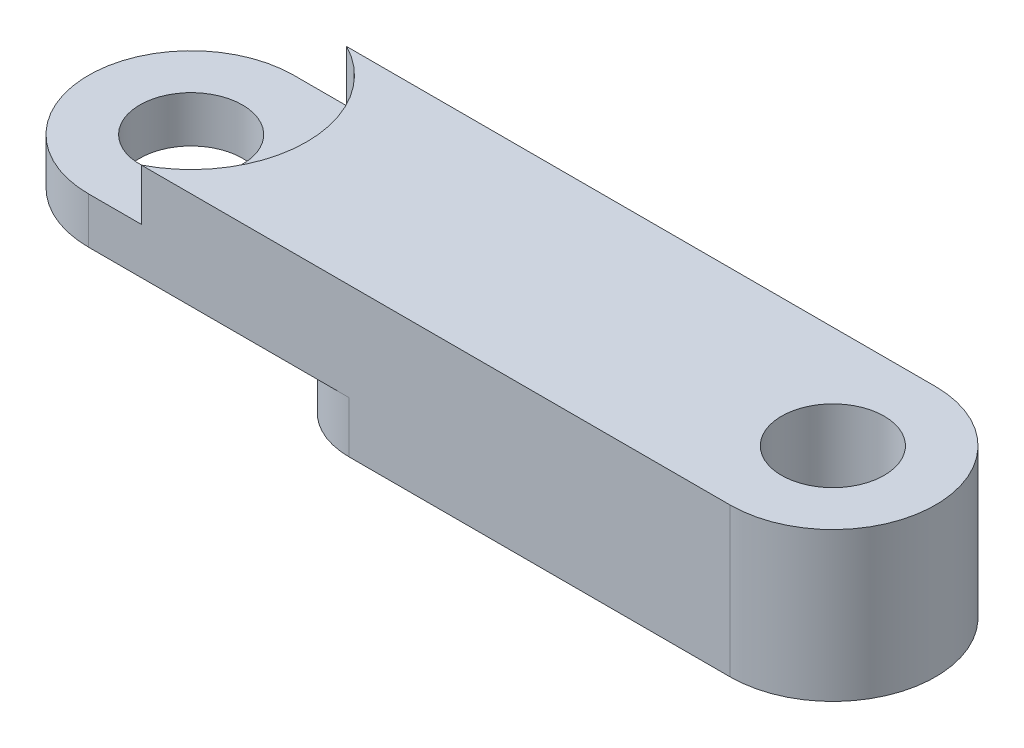
ISO-10303-21;
HEADER;
FILE_DESCRIPTION(('STEP AP214'),'2;1');
FILE_NAME('part.step','',(''),(''),'','','');
FILE_SCHEMA(('AUTOMOTIVE_DESIGN { 1 0 10303 214 1 1 1 1 }'));
ENDSEC;
DATA;
#1=APPLICATION_CONTEXT('core data for automotive mechanical design processes');
#2=APPLICATION_PROTOCOL_DEFINITION('international standard','automotive_design',2000,#1);
#3=PRODUCT_CONTEXT('',#1,'mechanical');
#4=PRODUCT('Part','Part','',(#3));
#5=PRODUCT_RELATED_PRODUCT_CATEGORY('part','',(#4));
#6=PRODUCT_DEFINITION_FORMATION('','',#4);
#7=PRODUCT_DEFINITION_CONTEXT('part definition',#1,'design');
#8=PRODUCT_DEFINITION('design','',#6,#7);
#9=PRODUCT_DEFINITION_SHAPE('','',#8);
#10=(LENGTH_UNIT() NAMED_UNIT(*) SI_UNIT(.MILLI.,.METRE.));
#11=(NAMED_UNIT(*) PLANE_ANGLE_UNIT() SI_UNIT($,.RADIAN.));
#12=(NAMED_UNIT(*) SI_UNIT($,.STERADIAN.) SOLID_ANGLE_UNIT());
#13=UNCERTAINTY_MEASURE_WITH_UNIT(LENGTH_MEASURE(1.E-05),#10,'distance_accuracy_value','');
#14=(GEOMETRIC_REPRESENTATION_CONTEXT(3) GLOBAL_UNCERTAINTY_ASSIGNED_CONTEXT((#13)) GLOBAL_UNIT_ASSIGNED_CONTEXT((#10,
#11,#12)) REPRESENTATION_CONTEXT('',''));
#15=CARTESIAN_POINT('',(0.,0.,0.));
#16=DIRECTION('',(0.,0.,1.));
#17=DIRECTION('',(1.,0.,0.));
#18=AXIS2_PLACEMENT_3D('',#15,#16,#17);
#19=CARTESIAN_POINT('',(-125.,58.,0.));
#20=DIRECTION('',(0.,-1.,0.));
#21=DIRECTION('',(0.,0.,-1.));
#22=AXIS2_PLACEMENT_3D('',#19,#20,#21);
#23=CYLINDRICAL_SURFACE('',#22,40.);
#24=CARTESIAN_POINT('',(-125.,20.,0.));
#25=DIRECTION('',(0.,-1.,0.));
#26=DIRECTION('',(0.,0.,-1.));
#27=AXIS2_PLACEMENT_3D('',#24,#25,#26);
#28=CIRCLE('',#27,40.);
#29=CARTESIAN_POINT('',(-125.,20.,40.));
#30=VERTEX_POINT('',#29);
#31=CARTESIAN_POINT('',(-125.,20.,-40.));
#32=VERTEX_POINT('',#31);
#33=EDGE_CURVE('E117',#30,#32,#28,.T.);
#34=ORIENTED_EDGE('',*,*,#33,.F.);
#35=DIRECTION('',(0.,-1.,0.));
#36=VECTOR('',#35,1.);
#37=CARTESIAN_POINT('',(-125.,58.,40.));
#38=LINE('',#37,#36);
#39=CARTESIAN_POINT('',(-125.,38.,40.));
#40=VERTEX_POINT('',#39);
#41=EDGE_CURVE('E129',#40,#30,#38,.T.);
#42=ORIENTED_EDGE('',*,*,#41,.F.);
#43=CARTESIAN_POINT('',(-125.,38.,0.));
#44=DIRECTION('',(0.,1.,0.));
#45=DIRECTION('',(0.,0.,1.));
#46=AXIS2_PLACEMENT_3D('',#43,#44,#45);
#47=CIRCLE('',#46,40.);
#48=CARTESIAN_POINT('',(-125.,38.,-40.));
#49=VERTEX_POINT('',#48);
#50=EDGE_CURVE('E191',#49,#40,#47,.T.);
#51=ORIENTED_EDGE('',*,*,#50,.F.);
#52=DIRECTION('',(0.,-1.,0.));
#53=VECTOR('',#52,1.);
#54=CARTESIAN_POINT('',(-125.,58.,-40.));
#55=LINE('',#54,#53);
#56=EDGE_CURVE('E131',#49,#32,#55,.T.);
#57=ORIENTED_EDGE('',*,*,#56,.T.);
#58=EDGE_LOOP('',(#34,#42,#51,#57));
#59=FACE_BOUND('',#58,.T.);
#60=ADVANCED_FACE('F41',(#59),#23,.T.);
#61=CARTESIAN_POINT('',(-125.,58.,0.));
#62=DIRECTION('',(0.,-1.,0.));
#63=DIRECTION('',(0.,0.,-1.));
#64=AXIS2_PLACEMENT_3D('',#61,#62,#63);
#65=CYLINDRICAL_SURFACE('',#64,20.);
#66=CARTESIAN_POINT('',(-125.,38.,0.));
#67=DIRECTION('',(0.,1.,0.));
#68=DIRECTION('',(0.,0.,1.));
#69=AXIS2_PLACEMENT_3D('',#66,#67,#68);
#70=CIRCLE('',#69,20.);
#71=CARTESIAN_POINT('',(-125.,38.,-20.));
#72=VERTEX_POINT('',#71);
#73=EDGE_CURVE('E146',#72,#72,#70,.T.);
#74=CARTESIAN_POINT('',(-125.,20.,0.));
#75=DIRECTION('',(0.,-1.,0.));
#76=DIRECTION('',(0.,0.,-1.));
#77=AXIS2_PLACEMENT_3D('',#74,#75,#76);
#78=CIRCLE('',#77,20.);
#79=CARTESIAN_POINT('',(-125.,20.,-20.));
#80=VERTEX_POINT('',#79);
#81=EDGE_CURVE('E124',#80,#80,#78,.T.);
#82=CARTESIAN_POINT('',(-125.,38.,-20.));
#83=CARTESIAN_POINT('',(-125.,37.8125,-20.));
#84=CARTESIAN_POINT('',(-125.,37.625,-20.));
#85=CARTESIAN_POINT('',(-125.,37.25,-20.));
#86=CARTESIAN_POINT('',(-125.,37.0625,-20.));
#87=CARTESIAN_POINT('',(-125.,36.6875,-20.));
#88=CARTESIAN_POINT('',(-125.,36.5,-20.));
#89=CARTESIAN_POINT('',(-125.,36.125,-20.));
#90=CARTESIAN_POINT('',(-125.,35.9375,-20.));
#91=CARTESIAN_POINT('',(-125.,35.5625,-20.));
#92=CARTESIAN_POINT('',(-125.,35.375,-20.));
#93=CARTESIAN_POINT('',(-125.,35.,-20.));
#94=CARTESIAN_POINT('',(-125.,34.8125,-20.));
#95=CARTESIAN_POINT('',(-125.,34.4375,-20.));
#96=CARTESIAN_POINT('',(-125.,34.25,-20.));
#97=CARTESIAN_POINT('',(-125.,33.875,-20.));
#98=CARTESIAN_POINT('',(-125.,33.6875,-20.));
#99=CARTESIAN_POINT('',(-125.,33.3125,-20.));
#100=CARTESIAN_POINT('',(-125.,33.125,-20.));
#101=CARTESIAN_POINT('',(-125.,32.75,-20.));
#102=CARTESIAN_POINT('',(-125.,32.5625,-20.));
#103=CARTESIAN_POINT('',(-125.,32.1875,-20.));
#104=CARTESIAN_POINT('',(-125.,32.,-20.));
#105=CARTESIAN_POINT('',(-125.,31.625,-20.));
#106=CARTESIAN_POINT('',(-125.,31.4375,-20.));
#107=CARTESIAN_POINT('',(-125.,31.0625,-20.));
#108=CARTESIAN_POINT('',(-125.,30.875,-20.));
#109=CARTESIAN_POINT('',(-125.,30.5,-20.));
#110=CARTESIAN_POINT('',(-125.,30.3125,-20.));
#111=CARTESIAN_POINT('',(-125.,29.9375,-20.));
#112=CARTESIAN_POINT('',(-125.,29.75,-20.));
#113=CARTESIAN_POINT('',(-125.,29.375,-20.));
#114=CARTESIAN_POINT('',(-125.,29.1875,-20.));
#115=CARTESIAN_POINT('',(-125.,28.8125,-20.));
#116=CARTESIAN_POINT('',(-125.,28.625,-20.));
#117=CARTESIAN_POINT('',(-125.,28.25,-20.));
#118=CARTESIAN_POINT('',(-125.,28.0625,-20.));
#119=CARTESIAN_POINT('',(-125.,27.6875,-20.));
#120=CARTESIAN_POINT('',(-125.,27.5,-20.));
#121=CARTESIAN_POINT('',(-125.,27.125,-20.));
#122=CARTESIAN_POINT('',(-125.,26.9375,-20.));
#123=CARTESIAN_POINT('',(-125.,26.5625,-20.));
#124=CARTESIAN_POINT('',(-125.,26.375,-20.));
#125=CARTESIAN_POINT('',(-125.,26.,-20.));
#126=CARTESIAN_POINT('',(-125.,25.8125,-20.));
#127=CARTESIAN_POINT('',(-125.,25.4375,-20.));
#128=CARTESIAN_POINT('',(-125.,25.25,-20.));
#129=CARTESIAN_POINT('',(-125.,24.875,-20.));
#130=CARTESIAN_POINT('',(-125.,24.6875,-20.));
#131=CARTESIAN_POINT('',(-125.,24.3125,-20.));
#132=CARTESIAN_POINT('',(-125.,24.125,-20.));
#133=CARTESIAN_POINT('',(-125.,23.75,-20.));
#134=CARTESIAN_POINT('',(-125.,23.5625,-20.));
#135=CARTESIAN_POINT('',(-125.,23.1875,-20.));
#136=CARTESIAN_POINT('',(-125.,23.,-20.));
#137=CARTESIAN_POINT('',(-125.,22.625,-20.));
#138=CARTESIAN_POINT('',(-125.,22.4375,-20.));
#139=CARTESIAN_POINT('',(-125.,22.0625,-20.));
#140=CARTESIAN_POINT('',(-125.,21.875,-20.));
#141=CARTESIAN_POINT('',(-125.,21.5,-20.));
#142=CARTESIAN_POINT('',(-125.,21.3125,-20.));
#143=CARTESIAN_POINT('',(-125.,20.9375,-20.));
#144=CARTESIAN_POINT('',(-125.,20.75,-20.));
#145=CARTESIAN_POINT('',(-125.,20.375,-20.));
#146=CARTESIAN_POINT('',(-125.,20.1875,-20.));
#147=CARTESIAN_POINT('',(-125.,20.,-20.));
#148=B_SPLINE_CURVE_WITH_KNOTS('',3,(#82,#83,#84,#85,#86,#87,#88,#89,#90,#91,#92,#93,#94,#95,
#96,#97,#98,#99,#100,#101,#102,#103,#104,#105,#106,#107,#108,#109,#110,#111,#112,#113,#114,#115,
#116,#117,#118,#119,#120,#121,#122,#123,#124,#125,#126,#127,#128,#129,#130,#131,#132,#133,#134,
#135,#136,#137,#138,#139,#140,#141,#142,#143,#144,#145,#146,#147),.UNSPECIFIED.,.F.,.F.,(4,2,2,
2,2,2,2,2,2,2,2,2,2,2,2,2,2,2,2,2,2,2,2,2,2,2,2,2,2,2,2,2,4),(0.,0.562500000000007,1.125,
1.68750000000001,2.25,2.8125,3.375,3.9375,4.5,5.0625,5.62500000000001,6.1875,6.75000000000001,
7.3125,7.875,8.4375,9.00000000000001,9.56250000000001,10.125,10.6875,11.25,11.8125,12.375,
12.9375,13.5,14.0625,14.625,15.1875,15.75,16.3125,16.875,17.4375,18.),.UNSPECIFIED.);
#149=EDGE_CURVE('BSEAM233',#72,#80,#148,.T.);
#150=ORIENTED_EDGE('',*,*,#73,.T.);
#151=ORIENTED_EDGE('',*,*,#81,.T.);
#152=ORIENTED_EDGE('',*,*,#149,.T.);
#153=ORIENTED_EDGE('',*,*,#149,.F.);
#154=EDGE_LOOP('',(#150,#152,#151,#153));
#155=FACE_BOUND('',#154,.T.);
#156=ADVANCED_FACE('F233',(#155),#65,.F.);
#157=CARTESIAN_POINT('',(-125.,58.,0.));
#158=DIRECTION('',(0.,1.,0.));
#159=DIRECTION('',(0.,0.,1.));
#160=AXIS2_PLACEMENT_3D('',#157,#158,#159);
#161=PLANE('',#160);
#162=CARTESIAN_POINT('',(-125.,58.,0.));
#163=DIRECTION('',(0.,1.,0.));
#164=DIRECTION('',(0.,0.,1.));
#165=AXIS2_PLACEMENT_3D('',#162,#163,#164);
#166=CIRCLE('',#165,45.);
#167=CARTESIAN_POINT('',(-104.384471871912,58.,40.));
#168=VERTEX_POINT('',#167);
#169=CARTESIAN_POINT('',(-104.384471871912,58.,-40.));
#170=VERTEX_POINT('',#169);
#171=EDGE_CURVE('E190',#168,#170,#166,.T.);
#172=ORIENTED_EDGE('',*,*,#171,.F.);
#173=DIRECTION('',(1.,0.,0.));
#174=VECTOR('',#173,1.);
#175=CARTESIAN_POINT('',(-125.,58.,40.));
#176=LINE('',#175,#174);
#177=CARTESIAN_POINT('',(125.,58.,40.));
#178=VERTEX_POINT('',#177);
#179=EDGE_CURVE('E206',#168,#178,#176,.T.);
#180=ORIENTED_EDGE('',*,*,#179,.T.);
#181=CARTESIAN_POINT('',(125.,58.,0.));
#182=DIRECTION('',(0.,1.,0.));
#183=DIRECTION('',(0.,0.,1.));
#184=AXIS2_PLACEMENT_3D('',#181,#182,#183);
#185=CIRCLE('',#184,40.);
#186=CARTESIAN_POINT('',(125.000000012017,58.,-40.));
#187=VERTEX_POINT('',#186);
#188=EDGE_CURVE('E208',#178,#187,#185,.T.);
#189=ORIENTED_EDGE('',*,*,#188,.T.);
#190=DIRECTION('',(-1.,0.,0.));
#191=VECTOR('',#190,1.);
#192=CARTESIAN_POINT('',(-125.,58.,-40.));
#193=LINE('',#192,#191);
#194=EDGE_CURVE('E209',#187,#170,#193,.T.);
#195=ORIENTED_EDGE('',*,*,#194,.T.);
#196=EDGE_LOOP('',(#172,#180,#189,#195));
#197=FACE_BOUND('',#196,.T.);
#198=CARTESIAN_POINT('',(125.,58.,0.));
#199=DIRECTION('',(0.,1.,0.));
#200=DIRECTION('',(0.,0.,1.));
#201=AXIS2_PLACEMENT_3D('',#198,#199,#200);
#202=CIRCLE('',#201,20.);
#203=CARTESIAN_POINT('',(125.,58.,-20.));
#204=VERTEX_POINT('',#203);
#205=EDGE_CURVE('E199',#204,#204,#202,.T.);
#206=ORIENTED_EDGE('',*,*,#205,.F.);
#207=EDGE_LOOP('',(#206));
#208=FACE_BOUND('',#207,.T.);
#209=ADVANCED_FACE('F238',(#197,#208),#161,.T.);
#210=CARTESIAN_POINT('',(-125.,0.,0.));
#211=DIRECTION('',(0.,1.,0.));
#212=DIRECTION('',(0.,0.,1.));
#213=AXIS2_PLACEMENT_3D('',#210,#211,#212);
#214=PLANE('',#213);
#215=DIRECTION('',(1.,0.,0.));
#216=VECTOR('',#215,1.);
#217=CARTESIAN_POINT('',(-125.,0.,40.));
#218=LINE('',#217,#216);
#219=CARTESIAN_POINT('',(-23.501817709407,0.,40.));
#220=VERTEX_POINT('',#219);
#221=CARTESIAN_POINT('',(125.,0.,40.));
#222=VERTEX_POINT('',#221);
#223=EDGE_CURVE('E201',#220,#222,#218,.T.);
#224=ORIENTED_EDGE('',*,*,#223,.F.);
#225=CARTESIAN_POINT('',(-23.501817709407,0.,10.));
#226=DIRECTION('',(0.,1.,0.));
#227=DIRECTION('',(0.,0.,1.));
#228=AXIS2_PLACEMENT_3D('',#225,#226,#227);
#229=CIRCLE('',#228,30.);
#230=CARTESIAN_POINT('',(-53.501817709407,0.,10.));
#231=VERTEX_POINT('',#230);
#232=EDGE_CURVE('E158',#220,#231,#229,.F.);
#233=ORIENTED_EDGE('',*,*,#232,.T.);
#234=DIRECTION('',(0.,0.,1.));
#235=VECTOR('',#234,1.);
#236=CARTESIAN_POINT('',(-53.501817709407,0.,-40.));
#237=LINE('',#236,#235);
#238=CARTESIAN_POINT('',(-53.501817709407,0.,-10.));
#239=VERTEX_POINT('',#238);
#240=EDGE_CURVE('E176',#239,#231,#237,.T.);
#241=ORIENTED_EDGE('',*,*,#240,.F.);
#242=CARTESIAN_POINT('',(-23.501817709407,0.,-10.));
#243=DIRECTION('',(0.,1.,0.));
#244=DIRECTION('',(0.,0.,1.));
#245=AXIS2_PLACEMENT_3D('',#242,#243,#244);
#246=CIRCLE('',#245,30.);
#247=CARTESIAN_POINT('',(-23.501817709407,0.,-40.));
#248=VERTEX_POINT('',#247);
#249=EDGE_CURVE('E156',#239,#248,#246,.F.);
#250=ORIENTED_EDGE('',*,*,#249,.T.);
#251=DIRECTION('',(-1.,0.,0.));
#252=VECTOR('',#251,1.);
#253=CARTESIAN_POINT('',(-125.,0.,-40.));
#254=LINE('',#253,#252);
#255=CARTESIAN_POINT('',(125.000000012017,0.,-40.));
#256=VERTEX_POINT('',#255);
#257=EDGE_CURVE('E172',#256,#248,#254,.T.);
#258=ORIENTED_EDGE('',*,*,#257,.F.);
#259=CARTESIAN_POINT('',(125.,0.,0.));
#260=DIRECTION('',(0.,1.,0.));
#261=DIRECTION('',(0.,0.,1.));
#262=AXIS2_PLACEMENT_3D('',#259,#260,#261);
#263=CIRCLE('',#262,40.);
#264=EDGE_CURVE('E212',#222,#256,#263,.T.);
#265=ORIENTED_EDGE('',*,*,#264,.F.);
#266=EDGE_LOOP('',(#224,#233,#241,#250,#258,#265));
#267=FACE_BOUND('',#266,.T.);
#268=CARTESIAN_POINT('',(125.,0.,0.));
#269=DIRECTION('',(0.,1.,0.));
#270=DIRECTION('',(0.,0.,1.));
#271=AXIS2_PLACEMENT_3D('',#268,#269,#270);
#272=CIRCLE('',#271,20.);
#273=CARTESIAN_POINT('',(125.,0.,-20.));
#274=VERTEX_POINT('',#273);
#275=EDGE_CURVE('E200',#274,#274,#272,.T.);
#276=ORIENTED_EDGE('',*,*,#275,.T.);
#277=EDGE_LOOP('',(#276));
#278=FACE_BOUND('',#277,.T.);
#279=ADVANCED_FACE('F181',(#267,#278),#214,.F.);
#280=CARTESIAN_POINT('',(-125.,58.,40.));
#281=DIRECTION('',(0.,0.,-1.));
#282=DIRECTION('',(-1.,0.,0.));
#283=AXIS2_PLACEMENT_3D('',#280,#281,#282);
#284=PLANE('',#283);
#285=DIRECTION('',(-1.,0.,0.));
#286=VECTOR('',#285,1.);
#287=CARTESIAN_POINT('',(-125.,20.,40.));
#288=LINE('',#287,#286);
#289=CARTESIAN_POINT('',(-23.501817709407,20.,40.));
#290=VERTEX_POINT('',#289);
#291=EDGE_CURVE('E111',#290,#30,#288,.T.);
#292=ORIENTED_EDGE('',*,*,#291,.F.);
#293=DIRECTION('',(0.,-1.,0.));
#294=VECTOR('',#293,1.);
#295=CARTESIAN_POINT('',(-23.501817709407,58.,40.));
#296=LINE('',#295,#294);
#297=EDGE_CURVE('E152',#290,#220,#296,.T.);
#298=ORIENTED_EDGE('',*,*,#297,.T.);
#299=ORIENTED_EDGE('',*,*,#223,.T.);
#300=DIRECTION('',(0.,-1.,0.));
#301=VECTOR('',#300,1.);
#302=CARTESIAN_POINT('',(125.,58.,40.));
#303=LINE('',#302,#301);
#304=EDGE_CURVE('E136',#178,#222,#303,.T.);
#305=ORIENTED_EDGE('',*,*,#304,.F.);
#306=ORIENTED_EDGE('',*,*,#179,.F.);
#307=DIRECTION('',(0.,1.,0.));
#308=VECTOR('',#307,1.);
#309=CARTESIAN_POINT('',(-104.384471871912,38.,40.));
#310=LINE('',#309,#308);
#311=CARTESIAN_POINT('',(-104.384471871912,38.,40.));
#312=VERTEX_POINT('',#311);
#313=EDGE_CURVE('E197',#168,#312,#310,.F.);
#314=ORIENTED_EDGE('',*,*,#313,.T.);
#315=DIRECTION('',(1.,0.,0.));
#316=VECTOR('',#315,1.);
#317=CARTESIAN_POINT('',(-125.,38.,40.));
#318=LINE('',#317,#316);
#319=EDGE_CURVE('E140',#40,#312,#318,.T.);
#320=ORIENTED_EDGE('',*,*,#319,.F.);
#321=ORIENTED_EDGE('',*,*,#41,.T.);
#322=EDGE_LOOP('',(#292,#298,#299,#305,#306,#314,#320,#321));
#323=FACE_BOUND('',#322,.T.);
#324=ADVANCED_FACE('F135',(#323),#284,.F.);
#325=CARTESIAN_POINT('',(125.,58.,0.));
#326=DIRECTION('',(0.,-1.,0.));
#327=DIRECTION('',(0.,0.,-1.));
#328=AXIS2_PLACEMENT_3D('',#325,#326,#327);
#329=CYLINDRICAL_SURFACE('',#328,40.);
#330=ORIENTED_EDGE('',*,*,#264,.T.);
#331=DIRECTION('',(0.,-1.,0.));
#332=VECTOR('',#331,1.);
#333=CARTESIAN_POINT('',(125.000000012017,58.,-40.));
#334=LINE('',#333,#332);
#335=EDGE_CURVE('E145',#187,#256,#334,.T.);
#336=ORIENTED_EDGE('',*,*,#335,.F.);
#337=ORIENTED_EDGE('',*,*,#188,.F.);
#338=ORIENTED_EDGE('',*,*,#304,.T.);
#339=EDGE_LOOP('',(#330,#336,#337,#338));
#340=FACE_BOUND('',#339,.T.);
#341=ADVANCED_FACE('F225',(#340),#329,.T.);
#342=CARTESIAN_POINT('',(-125.,58.,-40.));
#343=DIRECTION('',(0.,0.,1.));
#344=DIRECTION('',(1.,0.,0.));
#345=AXIS2_PLACEMENT_3D('',#342,#343,#344);
#346=PLANE('',#345);
#347=ORIENTED_EDGE('',*,*,#257,.T.);
#348=DIRECTION('',(0.,-1.,0.));
#349=VECTOR('',#348,1.);
#350=CARTESIAN_POINT('',(-23.501817709407,58.,-40.));
#351=LINE('',#350,#349);
#352=CARTESIAN_POINT('',(-23.501817709407,20.,-40.));
#353=VERTEX_POINT('',#352);
#354=EDGE_CURVE('E164',#248,#353,#351,.F.);
#355=ORIENTED_EDGE('',*,*,#354,.T.);
#356=DIRECTION('',(1.,0.,0.));
#357=VECTOR('',#356,1.);
#358=CARTESIAN_POINT('',(-125.,20.,-40.));
#359=LINE('',#358,#357);
#360=EDGE_CURVE('E54',#32,#353,#359,.T.);
#361=ORIENTED_EDGE('',*,*,#360,.F.);
#362=ORIENTED_EDGE('',*,*,#56,.F.);
#363=DIRECTION('',(-1.,0.,0.));
#364=VECTOR('',#363,1.);
#365=CARTESIAN_POINT('',(-125.,38.,-40.));
#366=LINE('',#365,#364);
#367=CARTESIAN_POINT('',(-104.384471871912,38.,-40.));
#368=VERTEX_POINT('',#367);
#369=EDGE_CURVE('E147',#368,#49,#366,.T.);
#370=ORIENTED_EDGE('',*,*,#369,.F.);
#371=DIRECTION('',(0.,1.,0.));
#372=VECTOR('',#371,1.);
#373=CARTESIAN_POINT('',(-104.384471871912,38.,-40.));
#374=LINE('',#373,#372);
#375=EDGE_CURVE('E139',#368,#170,#374,.T.);
#376=ORIENTED_EDGE('',*,*,#375,.T.);
#377=ORIENTED_EDGE('',*,*,#194,.F.);
#378=ORIENTED_EDGE('',*,*,#335,.T.);
#379=EDGE_LOOP('',(#347,#355,#361,#362,#370,#376,#377,#378));
#380=FACE_BOUND('',#379,.T.);
#381=ADVANCED_FACE('F166',(#380),#346,.F.);
#382=CARTESIAN_POINT('',(125.,58.,0.));
#383=DIRECTION('',(0.,-1.,0.));
#384=DIRECTION('',(0.,0.,-1.));
#385=AXIS2_PLACEMENT_3D('',#382,#383,#384);
#386=CYLINDRICAL_SURFACE('',#385,20.);
#387=CARTESIAN_POINT('',(125.,58.,-20.));
#388=CARTESIAN_POINT('',(125.,57.3958333333333,-20.));
#389=CARTESIAN_POINT('',(125.,56.7916666666667,-20.));
#390=CARTESIAN_POINT('',(125.,55.5833333333333,-20.));
#391=CARTESIAN_POINT('',(125.,54.9791666666667,-20.));
#392=CARTESIAN_POINT('',(125.,53.7708333333333,-20.));
#393=CARTESIAN_POINT('',(125.,53.1666666666667,-20.));
#394=CARTESIAN_POINT('',(125.,51.9583333333333,-20.));
#395=CARTESIAN_POINT('',(125.,51.3541666666667,-20.));
#396=CARTESIAN_POINT('',(125.,50.1458333333333,-20.));
#397=CARTESIAN_POINT('',(125.,49.5416666666667,-20.));
#398=CARTESIAN_POINT('',(125.,48.3333333333333,-20.));
#399=CARTESIAN_POINT('',(125.,47.7291666666667,-20.));
#400=CARTESIAN_POINT('',(125.,46.5208333333333,-20.));
#401=CARTESIAN_POINT('',(125.,45.9166666666667,-20.));
#402=CARTESIAN_POINT('',(125.,44.7083333333333,-20.));
#403=CARTESIAN_POINT('',(125.,44.1041666666667,-20.));
#404=CARTESIAN_POINT('',(125.,42.8958333333333,-20.));
#405=CARTESIAN_POINT('',(125.,42.2916666666667,-20.));
#406=CARTESIAN_POINT('',(125.,41.0833333333333,-20.));
#407=CARTESIAN_POINT('',(125.,40.4791666666667,-20.));
#408=CARTESIAN_POINT('',(125.,39.2708333333333,-20.));
#409=CARTESIAN_POINT('',(125.,38.6666666666667,-20.));
#410=CARTESIAN_POINT('',(125.,37.4583333333333,-20.));
#411=CARTESIAN_POINT('',(125.,36.8541666666667,-20.));
#412=CARTESIAN_POINT('',(125.,35.6458333333333,-20.));
#413=CARTESIAN_POINT('',(125.,35.0416666666667,-20.));
#414=CARTESIAN_POINT('',(125.,33.8333333333333,-20.));
#415=CARTESIAN_POINT('',(125.,33.2291666666667,-20.));
#416=CARTESIAN_POINT('',(125.,32.0208333333333,-20.));
#417=CARTESIAN_POINT('',(125.,31.4166666666667,-20.));
#418=CARTESIAN_POINT('',(125.,30.2083333333333,-20.));
#419=CARTESIAN_POINT('',(125.,29.6041666666667,-20.));
#420=CARTESIAN_POINT('',(125.,28.3958333333333,-20.));
#421=CARTESIAN_POINT('',(125.,27.7916666666667,-20.));
#422=CARTESIAN_POINT('',(125.,26.5833333333333,-20.));
#423=CARTESIAN_POINT('',(125.,25.9791666666667,-20.));
#424=CARTESIAN_POINT('',(125.,24.7708333333333,-20.));
#425=CARTESIAN_POINT('',(125.,24.1666666666667,-20.));
#426=CARTESIAN_POINT('',(125.,22.9583333333333,-20.));
#427=CARTESIAN_POINT('',(125.,22.3541666666667,-20.));
#428=CARTESIAN_POINT('',(125.,21.1458333333333,-20.));
#429=CARTESIAN_POINT('',(125.,20.5416666666667,-20.));
#430=CARTESIAN_POINT('',(125.,19.3333333333333,-20.));
#431=CARTESIAN_POINT('',(125.,18.7291666666667,-20.));
#432=CARTESIAN_POINT('',(125.,17.5208333333333,-20.));
#433=CARTESIAN_POINT('',(125.,16.9166666666667,-20.));
#434=CARTESIAN_POINT('',(125.,15.7083333333333,-20.));
#435=CARTESIAN_POINT('',(125.,15.1041666666667,-20.));
#436=CARTESIAN_POINT('',(125.,13.8958333333333,-20.));
#437=CARTESIAN_POINT('',(125.,13.2916666666667,-20.));
#438=CARTESIAN_POINT('',(125.,12.0833333333333,-20.));
#439=CARTESIAN_POINT('',(125.,11.4791666666667,-20.));
#440=CARTESIAN_POINT('',(125.,10.2708333333333,-20.));
#441=CARTESIAN_POINT('',(125.,9.66666666666667,-20.));
#442=CARTESIAN_POINT('',(125.,8.45833333333333,-20.));
#443=CARTESIAN_POINT('',(125.,7.85416666666667,-20.));
#444=CARTESIAN_POINT('',(125.,6.64583333333333,-20.));
#445=CARTESIAN_POINT('',(125.,6.04166666666667,-20.));
#446=CARTESIAN_POINT('',(125.,4.83333333333333,-20.));
#447=CARTESIAN_POINT('',(125.,4.22916666666667,-20.));
#448=CARTESIAN_POINT('',(125.,3.02083333333334,-20.));
#449=CARTESIAN_POINT('',(125.,2.41666666666667,-20.));
#450=CARTESIAN_POINT('',(125.,1.20833333333333,-20.));
#451=CARTESIAN_POINT('',(125.,0.604166666666666,-20.));
#452=CARTESIAN_POINT('',(125.,0.,-20.));
#453=B_SPLINE_CURVE_WITH_KNOTS('',3,(#387,#388,#389,#390,#391,#392,#393,#394,#395,#396,#397,
#398,#399,#400,#401,#402,#403,#404,#405,#406,#407,#408,#409,#410,#411,#412,#413,#414,#415,#416,
#417,#418,#419,#420,#421,#422,#423,#424,#425,#426,#427,#428,#429,#430,#431,#432,#433,#434,#435,
#436,#437,#438,#439,#440,#441,#442,#443,#444,#445,#446,#447,#448,#449,#450,#451,#452),
.UNSPECIFIED.,.F.,.F.,(4,2,2,2,2,2,2,2,2,2,2,2,2,2,2,2,2,2,2,2,2,2,2,2,2,2,2,2,2,2,2,2,4),(0.,
1.8125,3.625,5.4375,7.25000000000001,9.0625,10.875,12.6875,14.5,16.3125,18.125,19.9375,21.75,
23.5625,25.375,27.1875,29.,30.8125,32.625,34.4375,36.25,38.0625,39.875,41.6875,43.5,45.3125,
47.125,48.9375,50.75,52.5625,54.375,56.1875,58.),.UNSPECIFIED.);
#454=EDGE_CURVE('BSEAM248',#204,#274,#453,.T.);
#455=ORIENTED_EDGE('',*,*,#205,.T.);
#456=ORIENTED_EDGE('',*,*,#275,.F.);
#457=ORIENTED_EDGE('',*,*,#454,.T.);
#458=ORIENTED_EDGE('',*,*,#454,.F.);
#459=EDGE_LOOP('',(#455,#457,#456,#458));
#460=FACE_BOUND('',#459,.T.);
#461=ADVANCED_FACE('F248',(#460),#386,.F.);
#462=CARTESIAN_POINT('',(-125.,38.,0.));
#463=DIRECTION('',(0.,1.,0.));
#464=DIRECTION('',(0.,0.,1.));
#465=AXIS2_PLACEMENT_3D('',#462,#463,#464);
#466=CYLINDRICAL_SURFACE('',#465,45.);
#467=ORIENTED_EDGE('',*,*,#171,.T.);
#468=ORIENTED_EDGE('',*,*,#375,.F.);
#469=CARTESIAN_POINT('',(-125.,38.,0.));
#470=DIRECTION('',(0.,1.,0.));
#471=DIRECTION('',(0.,0.,1.));
#472=AXIS2_PLACEMENT_3D('',#469,#470,#471);
#473=CIRCLE('',#472,45.);
#474=EDGE_CURVE('E151',#312,#368,#473,.T.);
#475=ORIENTED_EDGE('',*,*,#474,.F.);
#476=ORIENTED_EDGE('',*,*,#313,.F.);
#477=EDGE_LOOP('',(#467,#468,#475,#476));
#478=FACE_BOUND('',#477,.T.);
#479=ADVANCED_FACE('F256',(#478),#466,.F.);
#480=CARTESIAN_POINT('',(-125.,38.,0.));
#481=DIRECTION('',(0.,1.,0.));
#482=DIRECTION('',(0.,0.,1.));
#483=AXIS2_PLACEMENT_3D('',#480,#481,#482);
#484=PLANE('',#483);
#485=ORIENTED_EDGE('',*,*,#73,.F.);
#486=EDGE_LOOP('',(#485));
#487=FACE_BOUND('',#486,.T.);
#488=ORIENTED_EDGE('',*,*,#319,.T.);
#489=ORIENTED_EDGE('',*,*,#474,.T.);
#490=ORIENTED_EDGE('',*,*,#369,.T.);
#491=ORIENTED_EDGE('',*,*,#50,.T.);
#492=EDGE_LOOP('',(#488,#489,#490,#491));
#493=FACE_BOUND('',#492,.T.);
#494=ADVANCED_FACE('F265',(#487,#493),#484,.T.);
#495=CARTESIAN_POINT('',(-125.,20.,0.));
#496=DIRECTION('',(0.,-1.,0.));
#497=DIRECTION('',(0.,0.,-1.));
#498=AXIS2_PLACEMENT_3D('',#495,#496,#497);
#499=PLANE('',#498);
#500=ORIENTED_EDGE('',*,*,#81,.F.);
#501=EDGE_LOOP('',(#500));
#502=FACE_BOUND('',#501,.T.);
#503=ORIENTED_EDGE('',*,*,#291,.T.);
#504=ORIENTED_EDGE('',*,*,#33,.T.);
#505=ORIENTED_EDGE('',*,*,#360,.T.);
#506=CARTESIAN_POINT('',(-23.501817709407,20.,-10.));
#507=DIRECTION('',(0.,-1.,0.));
#508=DIRECTION('',(0.,0.,-1.));
#509=AXIS2_PLACEMENT_3D('',#506,#507,#508);
#510=CIRCLE('',#509,30.);
#511=CARTESIAN_POINT('',(-53.501817709407,20.,-10.));
#512=VERTEX_POINT('',#511);
#513=EDGE_CURVE('E11',#353,#512,#510,.F.);
#514=ORIENTED_EDGE('',*,*,#513,.T.);
#515=DIRECTION('',(0.,0.,-1.));
#516=VECTOR('',#515,1.);
#517=CARTESIAN_POINT('',(-53.501817709407,20.,-40.));
#518=LINE('',#517,#516);
#519=CARTESIAN_POINT('',(-53.501817709407,20.,10.));
#520=VERTEX_POINT('',#519);
#521=EDGE_CURVE('E132',#520,#512,#518,.T.);
#522=ORIENTED_EDGE('',*,*,#521,.F.);
#523=CARTESIAN_POINT('',(-23.501817709407,20.,10.));
#524=DIRECTION('',(0.,-1.,0.));
#525=DIRECTION('',(0.,0.,-1.));
#526=AXIS2_PLACEMENT_3D('',#523,#524,#525);
#527=CIRCLE('',#526,30.);
#528=EDGE_CURVE('E47',#520,#290,#527,.F.);
#529=ORIENTED_EDGE('',*,*,#528,.T.);
#530=EDGE_LOOP('',(#503,#504,#505,#514,#522,#529));
#531=FACE_BOUND('',#530,.T.);
#532=ADVANCED_FACE('F116',(#502,#531),#499,.T.);
#533=CARTESIAN_POINT('',(-53.501817709407,183.853471990787,-40.));
#534=DIRECTION('',(1.,0.,0.));
#535=DIRECTION('',(0.,0.,-1.));
#536=AXIS2_PLACEMENT_3D('',#533,#534,#535);
#537=PLANE('',#536);
#538=ORIENTED_EDGE('',*,*,#240,.T.);
#539=DIRECTION('',(0.,-1.,0.));
#540=VECTOR('',#539,1.);
#541=CARTESIAN_POINT('',(-53.501817709407,183.853471990787,10.));
#542=LINE('',#541,#540);
#543=EDGE_CURVE('E162',#231,#520,#542,.F.);
#544=ORIENTED_EDGE('',*,*,#543,.T.);
#545=ORIENTED_EDGE('',*,*,#521,.T.);
#546=DIRECTION('',(0.,-1.,0.));
#547=VECTOR('',#546,1.);
#548=CARTESIAN_POINT('',(-53.501817709407,183.853471990787,-10.));
#549=LINE('',#548,#547);
#550=EDGE_CURVE('E159',#512,#239,#549,.T.);
#551=ORIENTED_EDGE('',*,*,#550,.T.);
#552=EDGE_LOOP('',(#538,#544,#545,#551));
#553=FACE_BOUND('',#552,.T.);
#554=ADVANCED_FACE('F179',(#553),#537,.F.);
#555=CARTESIAN_POINT('',(-23.501817709407,58.,10.));
#556=DIRECTION('',(0.,-1.,0.));
#557=DIRECTION('',(0.,0.,-1.));
#558=AXIS2_PLACEMENT_3D('',#555,#556,#557);
#559=CYLINDRICAL_SURFACE('',#558,30.);
#560=ORIENTED_EDGE('',*,*,#528,.F.);
#561=ORIENTED_EDGE('',*,*,#543,.F.);
#562=ORIENTED_EDGE('',*,*,#232,.F.);
#563=ORIENTED_EDGE('',*,*,#297,.F.);
#564=EDGE_LOOP('',(#560,#561,#562,#563));
#565=FACE_BOUND('',#564,.T.);
#566=ADVANCED_FACE('F226',(#565),#559,.T.);
#567=CARTESIAN_POINT('',(-23.501817709407,183.853471990787,-10.));
#568=DIRECTION('',(0.,-1.,0.));
#569=DIRECTION('',(0.,0.,-1.));
#570=AXIS2_PLACEMENT_3D('',#567,#568,#569);
#571=CYLINDRICAL_SURFACE('',#570,30.);
#572=ORIENTED_EDGE('',*,*,#513,.F.);
#573=ORIENTED_EDGE('',*,*,#354,.F.);
#574=ORIENTED_EDGE('',*,*,#249,.F.);
#575=ORIENTED_EDGE('',*,*,#550,.F.);
#576=EDGE_LOOP('',(#572,#573,#574,#575));
#577=FACE_BOUND('',#576,.T.);
#578=ADVANCED_FACE('F43',(#577),#571,.T.);
#579=CLOSED_SHELL('',(#60,#156,#209,#279,#324,#341,#381,#461,#479,#494,#532,#554,#566,#578));
#580=MANIFOLD_SOLID_BREP('B2',#579);
#581=ADVANCED_BREP_SHAPE_REPRESENTATION('',(#18,#580),#14);
#582=SHAPE_DEFINITION_REPRESENTATION(#9,#581);
ENDSEC;
END-ISO-10303-21;
